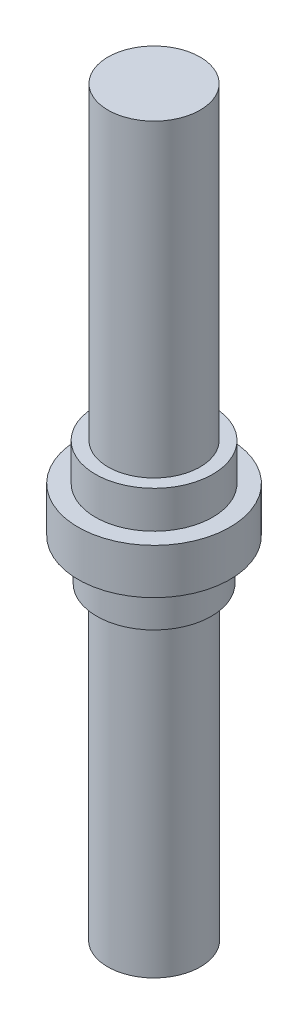
ISO-10303-21;
HEADER;
FILE_DESCRIPTION(('STEP AP214'),'2;1');
FILE_NAME('part.step','',(''),(''),'','','');
FILE_SCHEMA(('AUTOMOTIVE_DESIGN { 1 0 10303 214 1 1 1 1 }'));
ENDSEC;
DATA;
#1=APPLICATION_CONTEXT('core data for automotive mechanical design processes');
#2=APPLICATION_PROTOCOL_DEFINITION('international standard','automotive_design',2000,#1);
#3=PRODUCT_CONTEXT('',#1,'mechanical');
#4=PRODUCT('Part','Part','',(#3));
#5=PRODUCT_RELATED_PRODUCT_CATEGORY('part','',(#4));
#6=PRODUCT_DEFINITION_FORMATION('','',#4);
#7=PRODUCT_DEFINITION_CONTEXT('part definition',#1,'design');
#8=PRODUCT_DEFINITION('design','',#6,#7);
#9=PRODUCT_DEFINITION_SHAPE('','',#8);
#10=(LENGTH_UNIT() NAMED_UNIT(*) SI_UNIT(.MILLI.,.METRE.));
#11=(NAMED_UNIT(*) PLANE_ANGLE_UNIT() SI_UNIT($,.RADIAN.));
#12=(NAMED_UNIT(*) SI_UNIT($,.STERADIAN.) SOLID_ANGLE_UNIT());
#13=UNCERTAINTY_MEASURE_WITH_UNIT(LENGTH_MEASURE(1.E-05),#10,'distance_accuracy_value','');
#14=(GEOMETRIC_REPRESENTATION_CONTEXT(3) GLOBAL_UNCERTAINTY_ASSIGNED_CONTEXT((#13)) GLOBAL_UNIT_ASSIGNED_CONTEXT((#10,
#11,#12)) REPRESENTATION_CONTEXT('',''));
#15=CARTESIAN_POINT('',(0.,0.,0.));
#16=DIRECTION('',(0.,0.,1.));
#17=DIRECTION('',(1.,0.,0.));
#18=AXIS2_PLACEMENT_3D('',#15,#16,#17);
#19=CARTESIAN_POINT('',(0.,0.,0.));
#20=DIRECTION('',(0.,-1.,0.));
#21=DIRECTION('',(0.,0.,-1.));
#22=AXIS2_PLACEMENT_3D('',#19,#20,#21);
#23=CYLINDRICAL_SURFACE('',#22,1.5);
#24=CARTESIAN_POINT('',(0.,0.,0.));
#25=DIRECTION('',(0.,-1.,0.));
#26=DIRECTION('',(0.,0.,-1.));
#27=AXIS2_PLACEMENT_3D('',#24,#25,#26);
#28=CIRCLE('',#27,1.5);
#29=CARTESIAN_POINT('',(0.,0.,-1.5));
#30=VERTEX_POINT('',#29);
#31=EDGE_CURVE('E71',#30,#30,#28,.T.);
#32=ORIENTED_EDGE('',*,*,#31,.F.);
#33=EDGE_LOOP('',(#32));
#34=FACE_BOUND('',#33,.T.);
#35=CARTESIAN_POINT('',(0.,10.,0.));
#36=DIRECTION('',(0.,-1.,0.));
#37=DIRECTION('',(0.,0.,-1.));
#38=AXIS2_PLACEMENT_3D('',#35,#36,#37);
#39=CIRCLE('',#38,1.5);
#40=CARTESIAN_POINT('',(0.,10.,-1.5));
#41=VERTEX_POINT('',#40);
#42=EDGE_CURVE('E10',#41,#41,#39,.T.);
#43=ORIENTED_EDGE('',*,*,#42,.T.);
#44=EDGE_LOOP('',(#43));
#45=FACE_BOUND('',#44,.T.);
#46=ADVANCED_FACE('F37',(#34,#45),#23,.T.);
#47=CARTESIAN_POINT('',(0.,10.,0.));
#48=DIRECTION('',(0.,-1.,0.));
#49=DIRECTION('',(0.,0.,-1.));
#50=AXIS2_PLACEMENT_3D('',#47,#48,#49);
#51=PLANE('',#50);
#52=CARTESIAN_POINT('',(0.,10.,0.));
#53=DIRECTION('',(0.,-1.,0.));
#54=DIRECTION('',(0.,0.,-1.));
#55=AXIS2_PLACEMENT_3D('',#52,#53,#54);
#56=CIRCLE('',#55,1.8520202656089);
#57=CARTESIAN_POINT('',(0.,10.,-1.8520202656089));
#58=VERTEX_POINT('',#57);
#59=EDGE_CURVE('E43',#58,#58,#56,.T.);
#60=ORIENTED_EDGE('',*,*,#59,.T.);
#61=EDGE_LOOP('',(#60));
#62=FACE_BOUND('',#61,.T.);
#63=ORIENTED_EDGE('',*,*,#42,.F.);
#64=EDGE_LOOP('',(#63));
#65=FACE_BOUND('',#64,.T.);
#66=ADVANCED_FACE('F78',(#62,#65),#51,.T.);
#67=CARTESIAN_POINT('',(0.,0.,0.));
#68=DIRECTION('',(0.,-1.,0.));
#69=DIRECTION('',(0.,0.,-1.));
#70=AXIS2_PLACEMENT_3D('',#67,#68,#69);
#71=CYLINDRICAL_SURFACE('',#70,1.8520202656089);
#72=ORIENTED_EDGE('',*,*,#59,.F.);
#73=EDGE_LOOP('',(#72));
#74=FACE_BOUND('',#73,.T.);
#75=CARTESIAN_POINT('',(0.,11.3332395664005,0.));
#76=DIRECTION('',(0.,-1.,0.));
#77=DIRECTION('',(0.,0.,-1.));
#78=AXIS2_PLACEMENT_3D('',#75,#76,#77);
#79=CIRCLE('',#78,1.8520202656089);
#80=CARTESIAN_POINT('',(0.,11.3332395664005,-1.8520202656089));
#81=VERTEX_POINT('',#80);
#82=EDGE_CURVE('E47',#81,#81,#79,.T.);
#83=ORIENTED_EDGE('',*,*,#82,.T.);
#84=EDGE_LOOP('',(#83));
#85=FACE_BOUND('',#84,.T.);
#86=ADVANCED_FACE('F82',(#74,#85),#71,.T.);
#87=CARTESIAN_POINT('',(0.,11.3332395664005,0.));
#88=DIRECTION('',(0.,-1.,0.));
#89=DIRECTION('',(0.,0.,-1.));
#90=AXIS2_PLACEMENT_3D('',#87,#88,#89);
#91=PLANE('',#90);
#92=CARTESIAN_POINT('',(0.,11.3332395664005,0.));
#93=DIRECTION('',(0.,-1.,0.));
#94=DIRECTION('',(0.,0.,-1.));
#95=AXIS2_PLACEMENT_3D('',#92,#93,#94);
#96=CIRCLE('',#95,2.45692217788454);
#97=CARTESIAN_POINT('',(0.,11.3332395664005,-2.45692217788454));
#98=VERTEX_POINT('',#97);
#99=EDGE_CURVE('E51',#98,#98,#96,.T.);
#100=ORIENTED_EDGE('',*,*,#99,.T.);
#101=EDGE_LOOP('',(#100));
#102=FACE_BOUND('',#101,.T.);
#103=ORIENTED_EDGE('',*,*,#82,.F.);
#104=EDGE_LOOP('',(#103));
#105=FACE_BOUND('',#104,.T.);
#106=ADVANCED_FACE('F86',(#102,#105),#91,.T.);
#107=CARTESIAN_POINT('',(0.,0.,0.));
#108=DIRECTION('',(0.,-1.,0.));
#109=DIRECTION('',(0.,0.,-1.));
#110=AXIS2_PLACEMENT_3D('',#107,#108,#109);
#111=CYLINDRICAL_SURFACE('',#110,2.45692217788454);
#112=ORIENTED_EDGE('',*,*,#99,.F.);
#113=EDGE_LOOP('',(#112));
#114=FACE_BOUND('',#113,.T.);
#115=CARTESIAN_POINT('',(0.,12.7990800513771,0.));
#116=DIRECTION('',(0.,-1.,0.));
#117=DIRECTION('',(0.,0.,-1.));
#118=AXIS2_PLACEMENT_3D('',#115,#116,#117);
#119=CIRCLE('',#118,2.45692217788454);
#120=CARTESIAN_POINT('',(0.,12.7990800513771,-2.45692217788454));
#121=VERTEX_POINT('',#120);
#122=EDGE_CURVE('E56',#121,#121,#119,.T.);
#123=ORIENTED_EDGE('',*,*,#122,.T.);
#124=EDGE_LOOP('',(#123));
#125=FACE_BOUND('',#124,.T.);
#126=ADVANCED_FACE('F93',(#114,#125),#111,.T.);
#127=CARTESIAN_POINT('',(0.,12.7990800513771,0.));
#128=DIRECTION('',(0.,-1.,0.));
#129=DIRECTION('',(0.,0.,-1.));
#130=AXIS2_PLACEMENT_3D('',#127,#128,#129);
#131=PLANE('',#130);
#132=ORIENTED_EDGE('',*,*,#122,.F.);
#133=EDGE_LOOP('',(#132));
#134=FACE_BOUND('',#133,.T.);
#135=CARTESIAN_POINT('',(0.,12.7990800513771,0.));
#136=DIRECTION('',(0.,-1.,0.));
#137=DIRECTION('',(0.,0.,-1.));
#138=AXIS2_PLACEMENT_3D('',#135,#136,#137);
#139=CIRCLE('',#138,1.89809360221279);
#140=CARTESIAN_POINT('',(0.,12.7990800513771,-1.89809360221279));
#141=VERTEX_POINT('',#140);
#142=EDGE_CURVE('E59',#141,#141,#139,.T.);
#143=ORIENTED_EDGE('',*,*,#142,.T.);
#144=EDGE_LOOP('',(#143));
#145=FACE_BOUND('',#144,.T.);
#146=ADVANCED_FACE('F97',(#134,#145),#131,.F.);
#147=CARTESIAN_POINT('',(0.,0.,0.));
#148=DIRECTION('',(0.,-1.,0.));
#149=DIRECTION('',(0.,0.,-1.));
#150=AXIS2_PLACEMENT_3D('',#147,#148,#149);
#151=CYLINDRICAL_SURFACE('',#150,1.89809360221279);
#152=ORIENTED_EDGE('',*,*,#142,.F.);
#153=EDGE_LOOP('',(#152));
#154=FACE_BOUND('',#153,.T.);
#155=CARTESIAN_POINT('',(0.,14.0027108297471,0.));
#156=DIRECTION('',(0.,-1.,0.));
#157=DIRECTION('',(0.,0.,-1.));
#158=AXIS2_PLACEMENT_3D('',#155,#156,#157);
#159=CIRCLE('',#158,1.89809360221279);
#160=CARTESIAN_POINT('',(0.,14.0027108297471,-1.89809360221279));
#161=VERTEX_POINT('',#160);
#162=EDGE_CURVE('E62',#161,#161,#159,.T.);
#163=ORIENTED_EDGE('',*,*,#162,.T.);
#164=EDGE_LOOP('',(#163));
#165=FACE_BOUND('',#164,.T.);
#166=ADVANCED_FACE('F101',(#154,#165),#151,.T.);
#167=CARTESIAN_POINT('',(0.,14.0027108297471,0.));
#168=DIRECTION('',(0.,-1.,0.));
#169=DIRECTION('',(0.,0.,-1.));
#170=AXIS2_PLACEMENT_3D('',#167,#168,#169);
#171=PLANE('',#170);
#172=ORIENTED_EDGE('',*,*,#162,.F.);
#173=EDGE_LOOP('',(#172));
#174=FACE_BOUND('',#173,.T.);
#175=CARTESIAN_POINT('',(0.,14.0027108297471,0.));
#176=DIRECTION('',(0.,-1.,0.));
#177=DIRECTION('',(0.,0.,-1.));
#178=AXIS2_PLACEMENT_3D('',#175,#176,#177);
#179=CIRCLE('',#178,1.48971887383728);
#180=CARTESIAN_POINT('',(0.,14.0027108297471,-1.48971887383728));
#181=VERTEX_POINT('',#180);
#182=EDGE_CURVE('E65',#181,#181,#179,.T.);
#183=ORIENTED_EDGE('',*,*,#182,.T.);
#184=EDGE_LOOP('',(#183));
#185=FACE_BOUND('',#184,.T.);
#186=ADVANCED_FACE('F105',(#174,#185),#171,.F.);
#187=CARTESIAN_POINT('',(0.,0.,0.));
#188=DIRECTION('',(0.,-1.,0.));
#189=DIRECTION('',(0.,0.,-1.));
#190=AXIS2_PLACEMENT_3D('',#187,#188,#189);
#191=CYLINDRICAL_SURFACE('',#190,1.48971887383728);
#192=CARTESIAN_POINT('',(0.,24.0027108297471,0.));
#193=DIRECTION('',(0.,-1.,0.));
#194=DIRECTION('',(0.,0.,-1.));
#195=AXIS2_PLACEMENT_3D('',#192,#193,#194);
#196=CIRCLE('',#195,1.48971887383728);
#197=CARTESIAN_POINT('',(0.,24.0027108297471,-1.48971887383728));
#198=VERTEX_POINT('',#197);
#199=EDGE_CURVE('E68',#198,#198,#196,.T.);
#200=ORIENTED_EDGE('',*,*,#199,.T.);
#201=EDGE_LOOP('',(#200));
#202=FACE_BOUND('',#201,.T.);
#203=ORIENTED_EDGE('',*,*,#182,.F.);
#204=EDGE_LOOP('',(#203));
#205=FACE_BOUND('',#204,.T.);
#206=ADVANCED_FACE('F109',(#202,#205),#191,.T.);
#207=CARTESIAN_POINT('',(0.,24.0027108297471,0.));
#208=DIRECTION('',(0.,1.,0.));
#209=DIRECTION('',(0.,0.,1.));
#210=AXIS2_PLACEMENT_3D('',#207,#208,#209);
#211=PLANE('',#210);
#212=ORIENTED_EDGE('',*,*,#199,.F.);
#213=EDGE_LOOP('',(#212));
#214=FACE_BOUND('',#213,.T.);
#215=ADVANCED_FACE('F113',(#214),#211,.T.);
#216=CARTESIAN_POINT('',(0.,0.,0.));
#217=DIRECTION('',(0.,-1.,0.));
#218=DIRECTION('',(0.,0.,-1.));
#219=AXIS2_PLACEMENT_3D('',#216,#217,#218);
#220=PLANE('',#219);
#221=ORIENTED_EDGE('',*,*,#31,.T.);
#222=EDGE_LOOP('',(#221));
#223=FACE_BOUND('',#222,.T.);
#224=ADVANCED_FACE('F75',(#223),#220,.T.);
#225=CLOSED_SHELL('',(#46,#66,#86,#106,#126,#146,#166,#186,#206,#215,#224));
#226=MANIFOLD_SOLID_BREP('B2',#225);
#227=ADVANCED_BREP_SHAPE_REPRESENTATION('',(#18,#226),#14);
#228=SHAPE_DEFINITION_REPRESENTATION(#9,#227);
ENDSEC;
END-ISO-10303-21;
